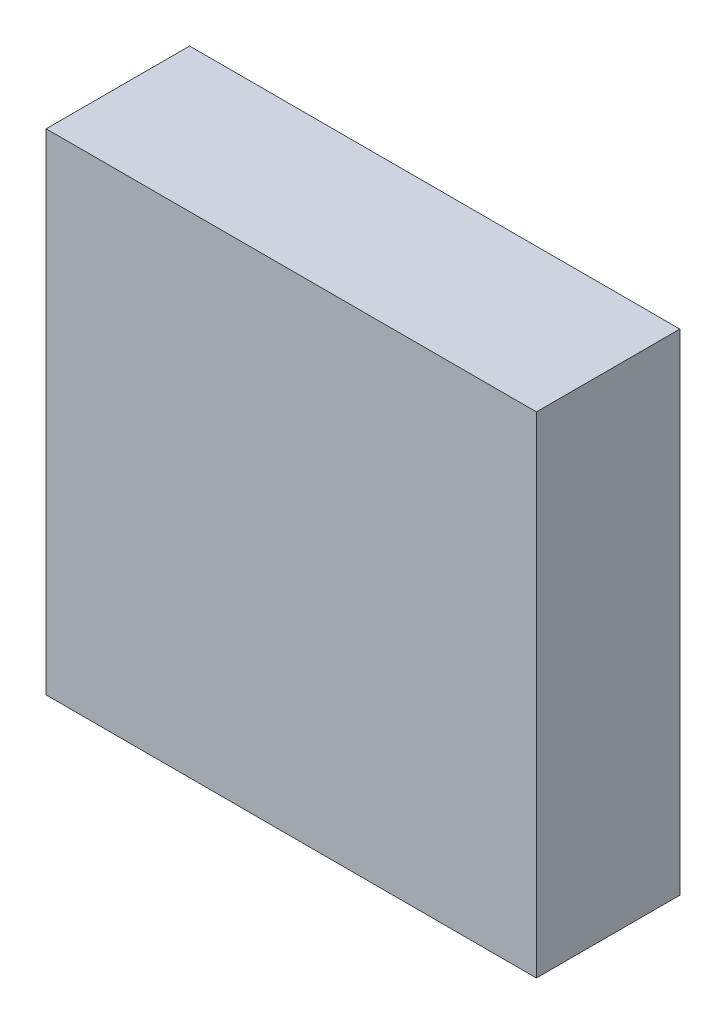
ISO-10303-21;
HEADER;
FILE_DESCRIPTION(('STEP AP214'),'2;1');
FILE_NAME('part.step','',(''),(''),'','','');
FILE_SCHEMA(('AUTOMOTIVE_DESIGN { 1 0 10303 214 1 1 1 1 }'));
ENDSEC;
DATA;
#1=APPLICATION_CONTEXT('core data for automotive mechanical design processes');
#2=APPLICATION_PROTOCOL_DEFINITION('international standard','automotive_design',2000,#1);
#3=PRODUCT_CONTEXT('',#1,'mechanical');
#4=PRODUCT('Part','Part','',(#3));
#5=PRODUCT_RELATED_PRODUCT_CATEGORY('part','',(#4));
#6=PRODUCT_DEFINITION_FORMATION('','',#4);
#7=PRODUCT_DEFINITION_CONTEXT('part definition',#1,'design');
#8=PRODUCT_DEFINITION('design','',#6,#7);
#9=PRODUCT_DEFINITION_SHAPE('','',#8);
#10=(LENGTH_UNIT() NAMED_UNIT(*) SI_UNIT(.MILLI.,.METRE.));
#11=(NAMED_UNIT(*) PLANE_ANGLE_UNIT() SI_UNIT($,.RADIAN.));
#12=(NAMED_UNIT(*) SI_UNIT($,.STERADIAN.) SOLID_ANGLE_UNIT());
#13=UNCERTAINTY_MEASURE_WITH_UNIT(LENGTH_MEASURE(1.E-05),#10,'distance_accuracy_value','');
#14=(GEOMETRIC_REPRESENTATION_CONTEXT(3) GLOBAL_UNCERTAINTY_ASSIGNED_CONTEXT((#13)) GLOBAL_UNIT_ASSIGNED_CONTEXT((#10,
#11,#12)) REPRESENTATION_CONTEXT('',''));
#15=CARTESIAN_POINT('',(0.,0.,0.));
#16=DIRECTION('',(0.,0.,1.));
#17=DIRECTION('',(1.,0.,0.));
#18=AXIS2_PLACEMENT_3D('',#15,#16,#17);
#19=CARTESIAN_POINT('',(1.67500046,-1.67500046,0.));
#20=DIRECTION('',(-1.,0.,0.));
#21=DIRECTION('',(0.,1.,0.));
#22=AXIS2_PLACEMENT_3D('',#19,#20,#21);
#23=PLANE('',#22);
#24=DIRECTION('',(0.,1.,0.));
#25=VECTOR('',#24,1.);
#26=CARTESIAN_POINT('',(1.67500046,-1.67500046,0.));
#27=LINE('',#26,#25);
#28=CARTESIAN_POINT('',(1.67500046,-1.67500046,0.));
#29=VERTEX_POINT('',#28);
#30=CARTESIAN_POINT('',(1.67500046,1.67500046,0.));
#31=VERTEX_POINT('',#30);
#32=EDGE_CURVE('E11',#29,#31,#27,.T.);
#33=ORIENTED_EDGE('',*,*,#32,.T.);
#34=DIRECTION('',(0.,0.,1.));
#35=VECTOR('',#34,1.);
#36=CARTESIAN_POINT('',(1.67500046,1.67500046,0.));
#37=LINE('',#36,#35);
#38=CARTESIAN_POINT('',(1.67500046,1.67500046,0.98000058));
#39=VERTEX_POINT('',#38);
#40=EDGE_CURVE('E24',#31,#39,#37,.T.);
#41=ORIENTED_EDGE('',*,*,#40,.T.);
#42=DIRECTION('',(0.,1.,0.));
#43=VECTOR('',#42,1.);
#44=CARTESIAN_POINT('',(1.67500046,-1.67500046,0.98000058));
#45=LINE('',#44,#43);
#46=CARTESIAN_POINT('',(1.67500046,-1.67500046,0.98000058));
#47=VERTEX_POINT('',#46);
#48=EDGE_CURVE('E87',#47,#39,#45,.T.);
#49=ORIENTED_EDGE('',*,*,#48,.F.);
#50=DIRECTION('',(0.,0.,1.));
#51=VECTOR('',#50,1.);
#52=CARTESIAN_POINT('',(1.67500046,-1.67500046,0.));
#53=LINE('',#52,#51);
#54=EDGE_CURVE('E36',#29,#47,#53,.T.);
#55=ORIENTED_EDGE('',*,*,#54,.F.);
#56=EDGE_LOOP('',(#33,#41,#49,#55));
#57=FACE_BOUND('',#56,.T.);
#58=ADVANCED_FACE('F17',(#57),#23,.F.);
#59=CARTESIAN_POINT('',(1.67500046,1.67500046,0.));
#60=DIRECTION('',(0.,-1.,0.));
#61=DIRECTION('',(-1.,0.,0.));
#62=AXIS2_PLACEMENT_3D('',#59,#60,#61);
#63=PLANE('',#62);
#64=DIRECTION('',(-1.,0.,0.));
#65=VECTOR('',#64,1.);
#66=CARTESIAN_POINT('',(1.67500046,1.67500046,0.));
#67=LINE('',#66,#65);
#68=CARTESIAN_POINT('',(-1.67500046,1.67500046,0.));
#69=VERTEX_POINT('',#68);
#70=EDGE_CURVE('E84',#31,#69,#67,.T.);
#71=ORIENTED_EDGE('',*,*,#70,.T.);
#72=DIRECTION('',(0.,0.,1.));
#73=VECTOR('',#72,1.);
#74=CARTESIAN_POINT('',(-1.67500046,1.67500046,0.));
#75=LINE('',#74,#73);
#76=CARTESIAN_POINT('',(-1.67500046,1.67500046,0.98000058));
#77=VERTEX_POINT('',#76);
#78=EDGE_CURVE('E82',#69,#77,#75,.T.);
#79=ORIENTED_EDGE('',*,*,#78,.T.);
#80=DIRECTION('',(-1.,0.,0.));
#81=VECTOR('',#80,1.);
#82=CARTESIAN_POINT('',(1.67500046,1.67500046,0.98000058));
#83=LINE('',#82,#81);
#84=EDGE_CURVE('E62',#39,#77,#83,.T.);
#85=ORIENTED_EDGE('',*,*,#84,.F.);
#86=ORIENTED_EDGE('',*,*,#40,.F.);
#87=EDGE_LOOP('',(#71,#79,#85,#86));
#88=FACE_BOUND('',#87,.T.);
#89=ADVANCED_FACE('F89',(#88),#63,.F.);
#90=CARTESIAN_POINT('',(-1.67500046,1.67500046,0.));
#91=DIRECTION('',(1.,0.,0.));
#92=DIRECTION('',(0.,-1.,0.));
#93=AXIS2_PLACEMENT_3D('',#90,#91,#92);
#94=PLANE('',#93);
#95=DIRECTION('',(0.,-1.,0.));
#96=VECTOR('',#95,1.);
#97=CARTESIAN_POINT('',(-1.67500046,1.67500046,0.));
#98=LINE('',#97,#96);
#99=CARTESIAN_POINT('',(-1.67500046,-1.67500046,0.));
#100=VERTEX_POINT('',#99);
#101=EDGE_CURVE('E71',#69,#100,#98,.T.);
#102=ORIENTED_EDGE('',*,*,#101,.T.);
#103=DIRECTION('',(0.,0.,1.));
#104=VECTOR('',#103,1.);
#105=CARTESIAN_POINT('',(-1.67500046,-1.67500046,0.));
#106=LINE('',#105,#104);
#107=CARTESIAN_POINT('',(-1.67500046,-1.67500046,0.98000058));
#108=VERTEX_POINT('',#107);
#109=EDGE_CURVE('E65',#100,#108,#106,.T.);
#110=ORIENTED_EDGE('',*,*,#109,.T.);
#111=DIRECTION('',(0.,-1.,0.));
#112=VECTOR('',#111,1.);
#113=CARTESIAN_POINT('',(-1.67500046,1.67500046,0.98000058));
#114=LINE('',#113,#112);
#115=EDGE_CURVE('E57',#77,#108,#114,.T.);
#116=ORIENTED_EDGE('',*,*,#115,.F.);
#117=ORIENTED_EDGE('',*,*,#78,.F.);
#118=EDGE_LOOP('',(#102,#110,#116,#117));
#119=FACE_BOUND('',#118,.T.);
#120=ADVANCED_FACE('F69',(#119),#94,.F.);
#121=CARTESIAN_POINT('',(-1.67500046,-1.67500046,0.));
#122=DIRECTION('',(0.,1.,0.));
#123=DIRECTION('',(1.,0.,0.));
#124=AXIS2_PLACEMENT_3D('',#121,#122,#123);
#125=PLANE('',#124);
#126=DIRECTION('',(1.,0.,0.));
#127=VECTOR('',#126,1.);
#128=CARTESIAN_POINT('',(-1.67500046,-1.67500046,0.));
#129=LINE('',#128,#127);
#130=EDGE_CURVE('E66',#100,#29,#129,.T.);
#131=ORIENTED_EDGE('',*,*,#130,.T.);
#132=ORIENTED_EDGE('',*,*,#54,.T.);
#133=DIRECTION('',(1.,0.,0.));
#134=VECTOR('',#133,1.);
#135=CARTESIAN_POINT('',(-1.67500046,-1.67500046,0.98000058));
#136=LINE('',#135,#134);
#137=EDGE_CURVE('E61',#108,#47,#136,.T.);
#138=ORIENTED_EDGE('',*,*,#137,.F.);
#139=ORIENTED_EDGE('',*,*,#109,.F.);
#140=EDGE_LOOP('',(#131,#132,#138,#139));
#141=FACE_BOUND('',#140,.T.);
#142=ADVANCED_FACE('F76',(#141),#125,.F.);
#143=CARTESIAN_POINT('',(0.,0.,0.));
#144=DIRECTION('',(0.,0.,1.));
#145=DIRECTION('',(1.,0.,0.));
#146=AXIS2_PLACEMENT_3D('',#143,#144,#145);
#147=PLANE('',#146);
#148=ORIENTED_EDGE('',*,*,#130,.F.);
#149=ORIENTED_EDGE('',*,*,#101,.F.);
#150=ORIENTED_EDGE('',*,*,#70,.F.);
#151=ORIENTED_EDGE('',*,*,#32,.F.);
#152=EDGE_LOOP('',(#148,#149,#150,#151));
#153=FACE_BOUND('',#152,.T.);
#154=ADVANCED_FACE('F91',(#153),#147,.F.);
#155=CARTESIAN_POINT('',(0.,0.,0.98000058));
#156=DIRECTION('',(0.,0.,1.));
#157=DIRECTION('',(1.,0.,0.));
#158=AXIS2_PLACEMENT_3D('',#155,#156,#157);
#159=PLANE('',#158);
#160=ORIENTED_EDGE('',*,*,#48,.T.);
#161=ORIENTED_EDGE('',*,*,#84,.T.);
#162=ORIENTED_EDGE('',*,*,#115,.T.);
#163=ORIENTED_EDGE('',*,*,#137,.T.);
#164=EDGE_LOOP('',(#160,#161,#162,#163));
#165=FACE_BOUND('',#164,.T.);
#166=ADVANCED_FACE('F59',(#165),#159,.T.);
#167=CLOSED_SHELL('',(#58,#89,#120,#142,#154,#166));
#168=MANIFOLD_SOLID_BREP('B1',#167);
#169=ADVANCED_BREP_SHAPE_REPRESENTATION('',(#18,#168),#14);
#170=SHAPE_DEFINITION_REPRESENTATION(#9,#169);
ENDSEC;
END-ISO-10303-21;
